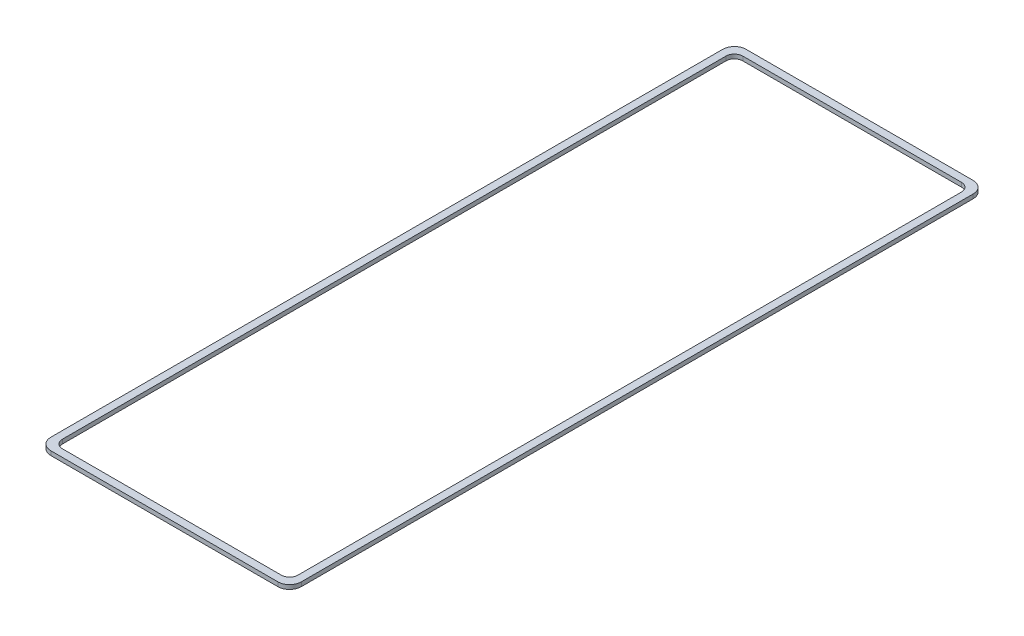
ISO-10303-21;
HEADER;
FILE_DESCRIPTION(('STEP AP214'),'2;1');
FILE_NAME('part.step','',(''),(''),'','','');
FILE_SCHEMA(('AUTOMOTIVE_DESIGN { 1 0 10303 214 1 1 1 1 }'));
ENDSEC;
DATA;
#1=APPLICATION_CONTEXT('core data for automotive mechanical design processes');
#2=APPLICATION_PROTOCOL_DEFINITION('international standard','automotive_design',2000,#1);
#3=PRODUCT_CONTEXT('',#1,'mechanical');
#4=PRODUCT('Part','Part','',(#3));
#5=PRODUCT_RELATED_PRODUCT_CATEGORY('part','',(#4));
#6=PRODUCT_DEFINITION_FORMATION('','',#4);
#7=PRODUCT_DEFINITION_CONTEXT('part definition',#1,'design');
#8=PRODUCT_DEFINITION('design','',#6,#7);
#9=PRODUCT_DEFINITION_SHAPE('','',#8);
#10=(LENGTH_UNIT() NAMED_UNIT(*) SI_UNIT(.MILLI.,.METRE.));
#11=(NAMED_UNIT(*) PLANE_ANGLE_UNIT() SI_UNIT($,.RADIAN.));
#12=(NAMED_UNIT(*) SI_UNIT($,.STERADIAN.) SOLID_ANGLE_UNIT());
#13=UNCERTAINTY_MEASURE_WITH_UNIT(LENGTH_MEASURE(1.E-05),#10,'distance_accuracy_value','');
#14=(GEOMETRIC_REPRESENTATION_CONTEXT(3) GLOBAL_UNCERTAINTY_ASSIGNED_CONTEXT((#13)) GLOBAL_UNIT_ASSIGNED_CONTEXT((#10,
#11,#12)) REPRESENTATION_CONTEXT('',''));
#15=CARTESIAN_POINT('',(0.,0.,0.));
#16=DIRECTION('',(0.,0.,1.));
#17=DIRECTION('',(1.,0.,0.));
#18=AXIS2_PLACEMENT_3D('',#15,#16,#17);
#19=CARTESIAN_POINT('',(-339.725,11.43,-942.975));
#20=DIRECTION('',(1.,0.,0.));
#21=DIRECTION('',(0.,0.,-1.));
#22=AXIS2_PLACEMENT_3D('',#19,#20,#21);
#23=PLANE('',#22);
#24=DIRECTION('',(0.,0.,1.));
#25=VECTOR('',#24,1.);
#26=CARTESIAN_POINT('',(-339.725,0.,-942.975));
#27=LINE('',#26,#25);
#28=CARTESIAN_POINT('',(-339.725,0.,-911.225));
#29=VERTEX_POINT('',#28);
#30=CARTESIAN_POINT('',(-339.725,0.,911.225));
#31=VERTEX_POINT('',#30);
#32=EDGE_CURVE('E261',#29,#31,#27,.T.);
#33=ORIENTED_EDGE('',*,*,#32,.T.);
#34=DIRECTION('',(0.,-1.,0.));
#35=VECTOR('',#34,1.);
#36=CARTESIAN_POINT('',(-339.725,11.43,911.225));
#37=LINE('',#36,#35);
#38=CARTESIAN_POINT('',(-339.725,11.43,911.225));
#39=VERTEX_POINT('',#38);
#40=EDGE_CURVE('E205',#31,#39,#37,.F.);
#41=ORIENTED_EDGE('',*,*,#40,.T.);
#42=DIRECTION('',(0.,0.,1.));
#43=VECTOR('',#42,1.);
#44=CARTESIAN_POINT('',(-339.725,11.43,-942.975));
#45=LINE('',#44,#43);
#46=CARTESIAN_POINT('',(-339.725,11.43,-911.225));
#47=VERTEX_POINT('',#46);
#48=EDGE_CURVE('E171',#47,#39,#45,.T.);
#49=ORIENTED_EDGE('',*,*,#48,.F.);
#50=DIRECTION('',(0.,-1.,0.));
#51=VECTOR('',#50,1.);
#52=CARTESIAN_POINT('',(-339.725,11.43,-911.225));
#53=LINE('',#52,#51);
#54=EDGE_CURVE('E202',#47,#29,#53,.T.);
#55=ORIENTED_EDGE('',*,*,#54,.T.);
#56=EDGE_LOOP('',(#33,#41,#49,#55));
#57=FACE_BOUND('',#56,.T.);
#58=ADVANCED_FACE('F32',(#57),#23,.F.);
#59=CARTESIAN_POINT('',(339.725,11.43,942.975));
#60=DIRECTION('',(0.,0.,-1.));
#61=DIRECTION('',(-1.,0.,0.));
#62=AXIS2_PLACEMENT_3D('',#59,#60,#61);
#63=PLANE('',#62);
#64=DIRECTION('',(1.,0.,0.));
#65=VECTOR('',#64,1.);
#66=CARTESIAN_POINT('',(339.725,0.,942.975));
#67=LINE('',#66,#65);
#68=CARTESIAN_POINT('',(-307.975,0.,942.975));
#69=VERTEX_POINT('',#68);
#70=CARTESIAN_POINT('',(307.975,0.,942.975));
#71=VERTEX_POINT('',#70);
#72=EDGE_CURVE('E177',#69,#71,#67,.T.);
#73=ORIENTED_EDGE('',*,*,#72,.T.);
#74=DIRECTION('',(0.,-1.,0.));
#75=VECTOR('',#74,1.);
#76=CARTESIAN_POINT('',(307.975,11.43,942.975));
#77=LINE('',#76,#75);
#78=CARTESIAN_POINT('',(307.975,11.43,942.975));
#79=VERTEX_POINT('',#78);
#80=EDGE_CURVE('E200',#71,#79,#77,.F.);
#81=ORIENTED_EDGE('',*,*,#80,.T.);
#82=DIRECTION('',(1.,0.,0.));
#83=VECTOR('',#82,1.);
#84=CARTESIAN_POINT('',(339.725,11.43,942.975));
#85=LINE('',#84,#83);
#86=CARTESIAN_POINT('',(-307.975,11.43,942.975));
#87=VERTEX_POINT('',#86);
#88=EDGE_CURVE('E175',#87,#79,#85,.T.);
#89=ORIENTED_EDGE('',*,*,#88,.F.);
#90=DIRECTION('',(0.,-1.,0.));
#91=VECTOR('',#90,1.);
#92=CARTESIAN_POINT('',(-307.975,11.43,942.975));
#93=LINE('',#92,#91);
#94=EDGE_CURVE('E197',#87,#69,#93,.T.);
#95=ORIENTED_EDGE('',*,*,#94,.T.);
#96=EDGE_LOOP('',(#73,#81,#89,#95));
#97=FACE_BOUND('',#96,.T.);
#98=ADVANCED_FACE('F284',(#97),#63,.F.);
#99=CARTESIAN_POINT('',(339.725,11.43,-942.975));
#100=DIRECTION('',(-1.,0.,0.));
#101=DIRECTION('',(0.,0.,1.));
#102=AXIS2_PLACEMENT_3D('',#99,#100,#101);
#103=PLANE('',#102);
#104=DIRECTION('',(0.,0.,-1.));
#105=VECTOR('',#104,1.);
#106=CARTESIAN_POINT('',(339.725,0.,-942.975));
#107=LINE('',#106,#105);
#108=CARTESIAN_POINT('',(339.725,0.,911.225));
#109=VERTEX_POINT('',#108);
#110=CARTESIAN_POINT('',(339.725,0.,-911.225));
#111=VERTEX_POINT('',#110);
#112=EDGE_CURVE('E172',#109,#111,#107,.T.);
#113=ORIENTED_EDGE('',*,*,#112,.T.);
#114=DIRECTION('',(0.,-1.,0.));
#115=VECTOR('',#114,1.);
#116=CARTESIAN_POINT('',(339.725,11.43,-911.225));
#117=LINE('',#116,#115);
#118=CARTESIAN_POINT('',(339.725,11.43,-911.225));
#119=VERTEX_POINT('',#118);
#120=EDGE_CURVE('E150',#111,#119,#117,.F.);
#121=ORIENTED_EDGE('',*,*,#120,.T.);
#122=DIRECTION('',(0.,0.,-1.));
#123=VECTOR('',#122,1.);
#124=CARTESIAN_POINT('',(339.725,11.43,-942.975));
#125=LINE('',#124,#123);
#126=CARTESIAN_POINT('',(339.725,11.43,911.225));
#127=VERTEX_POINT('',#126);
#128=EDGE_CURVE('E275',#127,#119,#125,.T.);
#129=ORIENTED_EDGE('',*,*,#128,.F.);
#130=DIRECTION('',(0.,-1.,0.));
#131=VECTOR('',#130,1.);
#132=CARTESIAN_POINT('',(339.725,11.43,911.225));
#133=LINE('',#132,#131);
#134=EDGE_CURVE('E155',#127,#109,#133,.T.);
#135=ORIENTED_EDGE('',*,*,#134,.T.);
#136=EDGE_LOOP('',(#113,#121,#129,#135));
#137=FACE_BOUND('',#136,.T.);
#138=ADVANCED_FACE('F293',(#137),#103,.F.);
#139=CARTESIAN_POINT('',(339.725,11.43,-942.975));
#140=DIRECTION('',(0.,0.,1.));
#141=DIRECTION('',(1.,0.,0.));
#142=AXIS2_PLACEMENT_3D('',#139,#140,#141);
#143=PLANE('',#142);
#144=DIRECTION('',(-1.,0.,0.));
#145=VECTOR('',#144,1.);
#146=CARTESIAN_POINT('',(339.725,11.43,-942.975));
#147=LINE('',#146,#145);
#148=CARTESIAN_POINT('',(307.975,11.43,-942.975));
#149=VERTEX_POINT('',#148);
#150=CARTESIAN_POINT('',(-307.975,11.43,-942.975));
#151=VERTEX_POINT('',#150);
#152=EDGE_CURVE('E165',#149,#151,#147,.T.);
#153=ORIENTED_EDGE('',*,*,#152,.F.);
#154=DIRECTION('',(0.,-1.,0.));
#155=VECTOR('',#154,1.);
#156=CARTESIAN_POINT('',(307.975,11.43,-942.975));
#157=LINE('',#156,#155);
#158=CARTESIAN_POINT('',(307.975,0.,-942.975));
#159=VERTEX_POINT('',#158);
#160=EDGE_CURVE('E149',#149,#159,#157,.T.);
#161=ORIENTED_EDGE('',*,*,#160,.T.);
#162=DIRECTION('',(-1.,0.,0.));
#163=VECTOR('',#162,1.);
#164=CARTESIAN_POINT('',(339.725,0.,-942.975));
#165=LINE('',#164,#163);
#166=CARTESIAN_POINT('',(-307.975,0.,-942.975));
#167=VERTEX_POINT('',#166);
#168=EDGE_CURVE('E162',#159,#167,#165,.T.);
#169=ORIENTED_EDGE('',*,*,#168,.T.);
#170=DIRECTION('',(0.,-1.,0.));
#171=VECTOR('',#170,1.);
#172=CARTESIAN_POINT('',(-307.975,11.43,-942.975));
#173=LINE('',#172,#171);
#174=EDGE_CURVE('E167',#167,#151,#173,.F.);
#175=ORIENTED_EDGE('',*,*,#174,.T.);
#176=EDGE_LOOP('',(#153,#161,#169,#175));
#177=FACE_BOUND('',#176,.T.);
#178=ADVANCED_FACE('F161',(#177),#143,.F.);
#179=CARTESIAN_POINT('',(0.,11.43,0.));
#180=DIRECTION('',(0.,-1.,0.));
#181=DIRECTION('',(0.,0.,-1.));
#182=AXIS2_PLACEMENT_3D('',#179,#180,#181);
#183=PLANE('',#182);
#184=DIRECTION('',(0.,0.,1.));
#185=VECTOR('',#184,1.);
#186=CARTESIAN_POINT('',(-319.405,11.43,-922.655));
#187=LINE('',#186,#185);
#188=CARTESIAN_POINT('',(-319.405,11.43,-899.795));
#189=VERTEX_POINT('',#188);
#190=CARTESIAN_POINT('',(-319.405,11.43,899.795));
#191=VERTEX_POINT('',#190);
#192=EDGE_CURVE('E243',#189,#191,#187,.T.);
#193=ORIENTED_EDGE('',*,*,#192,.F.);
#194=CARTESIAN_POINT('',(-296.545,11.43,-899.795));
#195=DIRECTION('',(0.,-1.,0.));
#196=DIRECTION('',(0.,0.,-1.));
#197=AXIS2_PLACEMENT_3D('',#194,#195,#196);
#198=CIRCLE('',#197,22.86);
#199=CARTESIAN_POINT('',(-296.545,11.43,-922.655));
#200=VERTEX_POINT('',#199);
#201=EDGE_CURVE('E226',#189,#200,#198,.T.);
#202=ORIENTED_EDGE('',*,*,#201,.T.);
#203=DIRECTION('',(-1.,0.,0.));
#204=VECTOR('',#203,1.);
#205=CARTESIAN_POINT('',(319.405,11.43,-922.655));
#206=LINE('',#205,#204);
#207=CARTESIAN_POINT('',(296.545,11.43,-922.655));
#208=VERTEX_POINT('',#207);
#209=EDGE_CURVE('E252',#208,#200,#206,.T.);
#210=ORIENTED_EDGE('',*,*,#209,.F.);
#211=CARTESIAN_POINT('',(296.545,11.43,-899.795));
#212=DIRECTION('',(0.,-1.,0.));
#213=DIRECTION('',(0.,0.,-1.));
#214=AXIS2_PLACEMENT_3D('',#211,#212,#213);
#215=CIRCLE('',#214,22.86);
#216=CARTESIAN_POINT('',(319.405,11.43,-899.795));
#217=VERTEX_POINT('',#216);
#218=EDGE_CURVE('E230',#208,#217,#215,.T.);
#219=ORIENTED_EDGE('',*,*,#218,.T.);
#220=DIRECTION('',(0.,0.,-1.));
#221=VECTOR('',#220,1.);
#222=CARTESIAN_POINT('',(319.405,11.43,922.655));
#223=LINE('',#222,#221);
#224=CARTESIAN_POINT('',(319.405,11.43,899.795));
#225=VERTEX_POINT('',#224);
#226=EDGE_CURVE('E270',#225,#217,#223,.T.);
#227=ORIENTED_EDGE('',*,*,#226,.F.);
#228=CARTESIAN_POINT('',(296.545,11.43,899.795));
#229=DIRECTION('',(0.,-1.,0.));
#230=DIRECTION('',(0.,0.,-1.));
#231=AXIS2_PLACEMENT_3D('',#228,#229,#230);
#232=CIRCLE('',#231,22.86);
#233=CARTESIAN_POINT('',(296.545,11.43,922.655));
#234=VERTEX_POINT('',#233);
#235=EDGE_CURVE('E234',#225,#234,#232,.T.);
#236=ORIENTED_EDGE('',*,*,#235,.T.);
#237=DIRECTION('',(1.,0.,0.));
#238=VECTOR('',#237,1.);
#239=CARTESIAN_POINT('',(-319.405,11.43,922.655));
#240=LINE('',#239,#238);
#241=CARTESIAN_POINT('',(-296.545,11.43,922.655));
#242=VERTEX_POINT('',#241);
#243=EDGE_CURVE('E244',#242,#234,#240,.T.);
#244=ORIENTED_EDGE('',*,*,#243,.F.);
#245=CARTESIAN_POINT('',(-296.545,11.43,899.795));
#246=DIRECTION('',(0.,-1.,0.));
#247=DIRECTION('',(0.,0.,-1.));
#248=AXIS2_PLACEMENT_3D('',#245,#246,#247);
#249=CIRCLE('',#248,22.86);
#250=EDGE_CURVE('E40',#242,#191,#249,.T.);
#251=ORIENTED_EDGE('',*,*,#250,.T.);
#252=EDGE_LOOP('',(#193,#202,#210,#219,#227,#236,#244,#251));
#253=FACE_BOUND('',#252,.T.);
#254=ORIENTED_EDGE('',*,*,#128,.T.);
#255=CARTESIAN_POINT('',(307.975,11.43,-911.225));
#256=DIRECTION('',(0.,-1.,0.));
#257=DIRECTION('',(0.,0.,-1.));
#258=AXIS2_PLACEMENT_3D('',#255,#256,#257);
#259=CIRCLE('',#258,31.75);
#260=EDGE_CURVE('E195',#119,#149,#259,.F.);
#261=ORIENTED_EDGE('',*,*,#260,.T.);
#262=ORIENTED_EDGE('',*,*,#152,.T.);
#263=CARTESIAN_POINT('',(-307.975,11.43,-911.225));
#264=DIRECTION('',(0.,-1.,0.));
#265=DIRECTION('',(0.,0.,-1.));
#266=AXIS2_PLACEMENT_3D('',#263,#264,#265);
#267=CIRCLE('',#266,31.75);
#268=EDGE_CURVE('E189',#151,#47,#267,.F.);
#269=ORIENTED_EDGE('',*,*,#268,.T.);
#270=ORIENTED_EDGE('',*,*,#48,.T.);
#271=CARTESIAN_POINT('',(-307.975,11.43,911.225));
#272=DIRECTION('',(0.,-1.,0.));
#273=DIRECTION('',(0.,0.,-1.));
#274=AXIS2_PLACEMENT_3D('',#271,#272,#273);
#275=CIRCLE('',#274,31.75);
#276=EDGE_CURVE('E191',#39,#87,#275,.F.);
#277=ORIENTED_EDGE('',*,*,#276,.T.);
#278=ORIENTED_EDGE('',*,*,#88,.T.);
#279=CARTESIAN_POINT('',(307.975,11.43,911.225));
#280=DIRECTION('',(0.,-1.,0.));
#281=DIRECTION('',(0.,0.,-1.));
#282=AXIS2_PLACEMENT_3D('',#279,#280,#281);
#283=CIRCLE('',#282,31.75);
#284=EDGE_CURVE('E193',#79,#127,#283,.F.);
#285=ORIENTED_EDGE('',*,*,#284,.T.);
#286=EDGE_LOOP('',(#254,#261,#262,#269,#270,#277,#278,#285));
#287=FACE_BOUND('',#286,.T.);
#288=ADVANCED_FACE('F241',(#253,#287),#183,.F.);
#289=CARTESIAN_POINT('',(0.,0.,0.));
#290=DIRECTION('',(0.,-1.,0.));
#291=DIRECTION('',(0.,0.,-1.));
#292=AXIS2_PLACEMENT_3D('',#289,#290,#291);
#293=PLANE('',#292);
#294=DIRECTION('',(0.,0.,-1.));
#295=VECTOR('',#294,1.);
#296=CARTESIAN_POINT('',(319.405,0.,922.655));
#297=LINE('',#296,#295);
#298=CARTESIAN_POINT('',(319.405,0.,899.795));
#299=VERTEX_POINT('',#298);
#300=CARTESIAN_POINT('',(319.405,0.,-899.795));
#301=VERTEX_POINT('',#300);
#302=EDGE_CURVE('E257',#299,#301,#297,.T.);
#303=ORIENTED_EDGE('',*,*,#302,.T.);
#304=CARTESIAN_POINT('',(296.545,0.,-899.795));
#305=DIRECTION('',(0.,-1.,0.));
#306=DIRECTION('',(0.,0.,-1.));
#307=AXIS2_PLACEMENT_3D('',#304,#305,#306);
#308=CIRCLE('',#307,22.86);
#309=CARTESIAN_POINT('',(296.545,0.,-922.655));
#310=VERTEX_POINT('',#309);
#311=EDGE_CURVE('E232',#301,#310,#308,.F.);
#312=ORIENTED_EDGE('',*,*,#311,.T.);
#313=DIRECTION('',(-1.,0.,0.));
#314=VECTOR('',#313,1.);
#315=CARTESIAN_POINT('',(319.405,0.,-922.655));
#316=LINE('',#315,#314);
#317=CARTESIAN_POINT('',(-296.545,0.,-922.655));
#318=VERTEX_POINT('',#317);
#319=EDGE_CURVE('E263',#310,#318,#316,.T.);
#320=ORIENTED_EDGE('',*,*,#319,.T.);
#321=CARTESIAN_POINT('',(-296.545,0.,-899.795));
#322=DIRECTION('',(0.,-1.,0.));
#323=DIRECTION('',(0.,0.,-1.));
#324=AXIS2_PLACEMENT_3D('',#321,#322,#323);
#325=CIRCLE('',#324,22.86);
#326=CARTESIAN_POINT('',(-319.405,0.,-899.795));
#327=VERTEX_POINT('',#326);
#328=EDGE_CURVE('E228',#318,#327,#325,.F.);
#329=ORIENTED_EDGE('',*,*,#328,.T.);
#330=DIRECTION('',(0.,0.,1.));
#331=VECTOR('',#330,1.);
#332=CARTESIAN_POINT('',(-319.405,0.,-922.655));
#333=LINE('',#332,#331);
#334=CARTESIAN_POINT('',(-319.405,0.,899.795));
#335=VERTEX_POINT('',#334);
#336=EDGE_CURVE('E258',#327,#335,#333,.T.);
#337=ORIENTED_EDGE('',*,*,#336,.T.);
#338=CARTESIAN_POINT('',(-296.545,0.,899.795));
#339=DIRECTION('',(0.,-1.,0.));
#340=DIRECTION('',(0.,0.,-1.));
#341=AXIS2_PLACEMENT_3D('',#338,#339,#340);
#342=CIRCLE('',#341,22.86);
#343=CARTESIAN_POINT('',(-296.545,0.,922.655));
#344=VERTEX_POINT('',#343);
#345=EDGE_CURVE('E11',#335,#344,#342,.F.);
#346=ORIENTED_EDGE('',*,*,#345,.T.);
#347=DIRECTION('',(1.,0.,0.));
#348=VECTOR('',#347,1.);
#349=CARTESIAN_POINT('',(-319.405,0.,922.655));
#350=LINE('',#349,#348);
#351=CARTESIAN_POINT('',(296.545,0.,922.655));
#352=VERTEX_POINT('',#351);
#353=EDGE_CURVE('E255',#344,#352,#350,.T.);
#354=ORIENTED_EDGE('',*,*,#353,.T.);
#355=CARTESIAN_POINT('',(296.545,0.,899.795));
#356=DIRECTION('',(0.,-1.,0.));
#357=DIRECTION('',(0.,0.,-1.));
#358=AXIS2_PLACEMENT_3D('',#355,#356,#357);
#359=CIRCLE('',#358,22.86);
#360=EDGE_CURVE('E236',#352,#299,#359,.F.);
#361=ORIENTED_EDGE('',*,*,#360,.T.);
#362=EDGE_LOOP('',(#303,#312,#320,#329,#337,#346,#354,#361));
#363=FACE_BOUND('',#362,.T.);
#364=ORIENTED_EDGE('',*,*,#168,.F.);
#365=CARTESIAN_POINT('',(307.975,0.,-911.225));
#366=DIRECTION('',(0.,-1.,0.));
#367=DIRECTION('',(0.,0.,-1.));
#368=AXIS2_PLACEMENT_3D('',#365,#366,#367);
#369=CIRCLE('',#368,31.75);
#370=EDGE_CURVE('E145',#159,#111,#369,.T.);
#371=ORIENTED_EDGE('',*,*,#370,.T.);
#372=ORIENTED_EDGE('',*,*,#112,.F.);
#373=CARTESIAN_POINT('',(307.975,0.,911.225));
#374=DIRECTION('',(0.,-1.,0.));
#375=DIRECTION('',(0.,0.,-1.));
#376=AXIS2_PLACEMENT_3D('',#373,#374,#375);
#377=CIRCLE('',#376,31.75);
#378=EDGE_CURVE('E156',#109,#71,#377,.T.);
#379=ORIENTED_EDGE('',*,*,#378,.T.);
#380=ORIENTED_EDGE('',*,*,#72,.F.);
#381=CARTESIAN_POINT('',(-307.975,0.,911.225));
#382=DIRECTION('',(0.,-1.,0.));
#383=DIRECTION('',(0.,0.,-1.));
#384=AXIS2_PLACEMENT_3D('',#381,#382,#383);
#385=CIRCLE('',#384,31.75);
#386=EDGE_CURVE('E183',#69,#31,#385,.T.);
#387=ORIENTED_EDGE('',*,*,#386,.T.);
#388=ORIENTED_EDGE('',*,*,#32,.F.);
#389=CARTESIAN_POINT('',(-307.975,0.,-911.225));
#390=DIRECTION('',(0.,-1.,0.));
#391=DIRECTION('',(0.,0.,-1.));
#392=AXIS2_PLACEMENT_3D('',#389,#390,#391);
#393=CIRCLE('',#392,31.75);
#394=EDGE_CURVE('E166',#29,#167,#393,.T.);
#395=ORIENTED_EDGE('',*,*,#394,.T.);
#396=EDGE_LOOP('',(#364,#371,#372,#379,#380,#387,#388,#395));
#397=FACE_BOUND('',#396,.T.);
#398=ADVANCED_FACE('F169',(#363,#397),#293,.T.);
#399=CARTESIAN_POINT('',(319.405,0.,-922.655));
#400=DIRECTION('',(0.,0.,-1.));
#401=DIRECTION('',(-1.,0.,0.));
#402=AXIS2_PLACEMENT_3D('',#399,#400,#401);
#403=PLANE('',#402);
#404=ORIENTED_EDGE('',*,*,#209,.T.);
#405=DIRECTION('',(0.,1.,0.));
#406=VECTOR('',#405,1.);
#407=CARTESIAN_POINT('',(-296.545,0.,-922.655));
#408=LINE('',#407,#406);
#409=EDGE_CURVE('E215',#200,#318,#408,.F.);
#410=ORIENTED_EDGE('',*,*,#409,.T.);
#411=ORIENTED_EDGE('',*,*,#319,.F.);
#412=DIRECTION('',(0.,1.,0.));
#413=VECTOR('',#412,1.);
#414=CARTESIAN_POINT('',(296.545,11.43,-922.655));
#415=LINE('',#414,#413);
#416=EDGE_CURVE('E212',#310,#208,#415,.T.);
#417=ORIENTED_EDGE('',*,*,#416,.T.);
#418=EDGE_LOOP('',(#404,#410,#411,#417));
#419=FACE_BOUND('',#418,.T.);
#420=ADVANCED_FACE('F345',(#419),#403,.F.);
#421=CARTESIAN_POINT('',(319.405,0.,922.655));
#422=DIRECTION('',(1.,0.,0.));
#423=DIRECTION('',(0.,0.,-1.));
#424=AXIS2_PLACEMENT_3D('',#421,#422,#423);
#425=PLANE('',#424);
#426=ORIENTED_EDGE('',*,*,#226,.T.);
#427=DIRECTION('',(0.,1.,0.));
#428=VECTOR('',#427,1.);
#429=CARTESIAN_POINT('',(319.405,0.,-899.795));
#430=LINE('',#429,#428);
#431=EDGE_CURVE('E220',#217,#301,#430,.F.);
#432=ORIENTED_EDGE('',*,*,#431,.T.);
#433=ORIENTED_EDGE('',*,*,#302,.F.);
#434=DIRECTION('',(0.,1.,0.));
#435=VECTOR('',#434,1.);
#436=CARTESIAN_POINT('',(319.405,11.43,899.795));
#437=LINE('',#436,#435);
#438=EDGE_CURVE('E217',#299,#225,#437,.T.);
#439=ORIENTED_EDGE('',*,*,#438,.T.);
#440=EDGE_LOOP('',(#426,#432,#433,#439));
#441=FACE_BOUND('',#440,.T.);
#442=ADVANCED_FACE('F337',(#441),#425,.F.);
#443=CARTESIAN_POINT('',(-319.405,0.,922.655));
#444=DIRECTION('',(0.,0.,1.));
#445=DIRECTION('',(1.,0.,0.));
#446=AXIS2_PLACEMENT_3D('',#443,#444,#445);
#447=PLANE('',#446);
#448=ORIENTED_EDGE('',*,*,#243,.T.);
#449=DIRECTION('',(0.,1.,0.));
#450=VECTOR('',#449,1.);
#451=CARTESIAN_POINT('',(296.545,0.,922.655));
#452=LINE('',#451,#450);
#453=EDGE_CURVE('E47',#234,#352,#452,.F.);
#454=ORIENTED_EDGE('',*,*,#453,.T.);
#455=ORIENTED_EDGE('',*,*,#353,.F.);
#456=DIRECTION('',(0.,1.,0.));
#457=VECTOR('',#456,1.);
#458=CARTESIAN_POINT('',(-296.545,11.43,922.655));
#459=LINE('',#458,#457);
#460=EDGE_CURVE('E222',#344,#242,#459,.T.);
#461=ORIENTED_EDGE('',*,*,#460,.T.);
#462=EDGE_LOOP('',(#448,#454,#455,#461));
#463=FACE_BOUND('',#462,.T.);
#464=ADVANCED_FACE('F254',(#463),#447,.F.);
#465=CARTESIAN_POINT('',(-319.405,0.,-922.655));
#466=DIRECTION('',(-1.,0.,0.));
#467=DIRECTION('',(0.,0.,1.));
#468=AXIS2_PLACEMENT_3D('',#465,#466,#467);
#469=PLANE('',#468);
#470=ORIENTED_EDGE('',*,*,#336,.F.);
#471=DIRECTION('',(0.,1.,0.));
#472=VECTOR('',#471,1.);
#473=CARTESIAN_POINT('',(-319.405,11.43,-899.795));
#474=LINE('',#473,#472);
#475=EDGE_CURVE('E209',#327,#189,#474,.T.);
#476=ORIENTED_EDGE('',*,*,#475,.T.);
#477=ORIENTED_EDGE('',*,*,#192,.T.);
#478=DIRECTION('',(0.,1.,0.));
#479=VECTOR('',#478,1.);
#480=CARTESIAN_POINT('',(-319.405,0.,899.795));
#481=LINE('',#480,#479);
#482=EDGE_CURVE('E207',#191,#335,#481,.F.);
#483=ORIENTED_EDGE('',*,*,#482,.T.);
#484=EDGE_LOOP('',(#470,#476,#477,#483));
#485=FACE_BOUND('',#484,.T.);
#486=ADVANCED_FACE('F250',(#485),#469,.F.);
#487=CARTESIAN_POINT('',(307.975,11.43,-911.225));
#488=DIRECTION('',(0.,-1.,0.));
#489=DIRECTION('',(0.,0.,-1.));
#490=AXIS2_PLACEMENT_3D('',#487,#488,#489);
#491=CYLINDRICAL_SURFACE('',#490,31.75);
#492=ORIENTED_EDGE('',*,*,#260,.F.);
#493=ORIENTED_EDGE('',*,*,#120,.F.);
#494=ORIENTED_EDGE('',*,*,#370,.F.);
#495=ORIENTED_EDGE('',*,*,#160,.F.);
#496=EDGE_LOOP('',(#492,#493,#494,#495));
#497=FACE_BOUND('',#496,.T.);
#498=ADVANCED_FACE('F148',(#497),#491,.T.);
#499=CARTESIAN_POINT('',(307.975,11.43,911.225));
#500=DIRECTION('',(0.,-1.,0.));
#501=DIRECTION('',(0.,0.,-1.));
#502=AXIS2_PLACEMENT_3D('',#499,#500,#501);
#503=CYLINDRICAL_SURFACE('',#502,31.75);
#504=ORIENTED_EDGE('',*,*,#284,.F.);
#505=ORIENTED_EDGE('',*,*,#80,.F.);
#506=ORIENTED_EDGE('',*,*,#378,.F.);
#507=ORIENTED_EDGE('',*,*,#134,.F.);
#508=EDGE_LOOP('',(#504,#505,#506,#507));
#509=FACE_BOUND('',#508,.T.);
#510=ADVANCED_FACE('F289',(#509),#503,.T.);
#511=CARTESIAN_POINT('',(-307.975,11.43,911.225));
#512=DIRECTION('',(0.,-1.,0.));
#513=DIRECTION('',(0.,0.,-1.));
#514=AXIS2_PLACEMENT_3D('',#511,#512,#513);
#515=CYLINDRICAL_SURFACE('',#514,31.75);
#516=ORIENTED_EDGE('',*,*,#276,.F.);
#517=ORIENTED_EDGE('',*,*,#40,.F.);
#518=ORIENTED_EDGE('',*,*,#386,.F.);
#519=ORIENTED_EDGE('',*,*,#94,.F.);
#520=EDGE_LOOP('',(#516,#517,#518,#519));
#521=FACE_BOUND('',#520,.T.);
#522=ADVANCED_FACE('F312',(#521),#515,.T.);
#523=CARTESIAN_POINT('',(-307.975,11.43,-911.225));
#524=DIRECTION('',(0.,-1.,0.));
#525=DIRECTION('',(0.,0.,-1.));
#526=AXIS2_PLACEMENT_3D('',#523,#524,#525);
#527=CYLINDRICAL_SURFACE('',#526,31.75);
#528=ORIENTED_EDGE('',*,*,#268,.F.);
#529=ORIENTED_EDGE('',*,*,#174,.F.);
#530=ORIENTED_EDGE('',*,*,#394,.F.);
#531=ORIENTED_EDGE('',*,*,#54,.F.);
#532=EDGE_LOOP('',(#528,#529,#530,#531));
#533=FACE_BOUND('',#532,.T.);
#534=ADVANCED_FACE('F315',(#533),#527,.T.);
#535=CARTESIAN_POINT('',(-296.545,0.,-899.795));
#536=DIRECTION('',(0.,-1.,0.));
#537=DIRECTION('',(0.,0.,-1.));
#538=AXIS2_PLACEMENT_3D('',#535,#536,#537);
#539=CYLINDRICAL_SURFACE('',#538,22.86);
#540=ORIENTED_EDGE('',*,*,#328,.F.);
#541=ORIENTED_EDGE('',*,*,#409,.F.);
#542=ORIENTED_EDGE('',*,*,#201,.F.);
#543=ORIENTED_EDGE('',*,*,#475,.F.);
#544=EDGE_LOOP('',(#540,#541,#542,#543));
#545=FACE_BOUND('',#544,.T.);
#546=ADVANCED_FACE('F319',(#545),#539,.F.);
#547=CARTESIAN_POINT('',(296.545,0.,-899.795));
#548=DIRECTION('',(0.,-1.,0.));
#549=DIRECTION('',(0.,0.,-1.));
#550=AXIS2_PLACEMENT_3D('',#547,#548,#549);
#551=CYLINDRICAL_SURFACE('',#550,22.86);
#552=ORIENTED_EDGE('',*,*,#311,.F.);
#553=ORIENTED_EDGE('',*,*,#431,.F.);
#554=ORIENTED_EDGE('',*,*,#218,.F.);
#555=ORIENTED_EDGE('',*,*,#416,.F.);
#556=EDGE_LOOP('',(#552,#553,#554,#555));
#557=FACE_BOUND('',#556,.T.);
#558=ADVANCED_FACE('F323',(#557),#551,.F.);
#559=CARTESIAN_POINT('',(296.545,0.,899.795));
#560=DIRECTION('',(0.,-1.,0.));
#561=DIRECTION('',(0.,0.,-1.));
#562=AXIS2_PLACEMENT_3D('',#559,#560,#561);
#563=CYLINDRICAL_SURFACE('',#562,22.86);
#564=ORIENTED_EDGE('',*,*,#360,.F.);
#565=ORIENTED_EDGE('',*,*,#453,.F.);
#566=ORIENTED_EDGE('',*,*,#235,.F.);
#567=ORIENTED_EDGE('',*,*,#438,.F.);
#568=EDGE_LOOP('',(#564,#565,#566,#567));
#569=FACE_BOUND('',#568,.T.);
#570=ADVANCED_FACE('F326',(#569),#563,.F.);
#571=CARTESIAN_POINT('',(-296.545,0.,899.795));
#572=DIRECTION('',(0.,-1.,0.));
#573=DIRECTION('',(0.,0.,-1.));
#574=AXIS2_PLACEMENT_3D('',#571,#572,#573);
#575=CYLINDRICAL_SURFACE('',#574,22.86);
#576=ORIENTED_EDGE('',*,*,#345,.F.);
#577=ORIENTED_EDGE('',*,*,#482,.F.);
#578=ORIENTED_EDGE('',*,*,#250,.F.);
#579=ORIENTED_EDGE('',*,*,#460,.F.);
#580=EDGE_LOOP('',(#576,#577,#578,#579));
#581=FACE_BOUND('',#580,.T.);
#582=ADVANCED_FACE('F34',(#581),#575,.F.);
#583=CLOSED_SHELL('',(#58,#98,#138,#178,#288,#398,#420,#442,#464,#486,#498,#510,#522,#534,#546,
#558,#570,#582));
#584=MANIFOLD_SOLID_BREP('B2',#583);
#585=ADVANCED_BREP_SHAPE_REPRESENTATION('',(#18,#584),#14);
#586=SHAPE_DEFINITION_REPRESENTATION(#9,#585);
ENDSEC;
END-ISO-10303-21;
